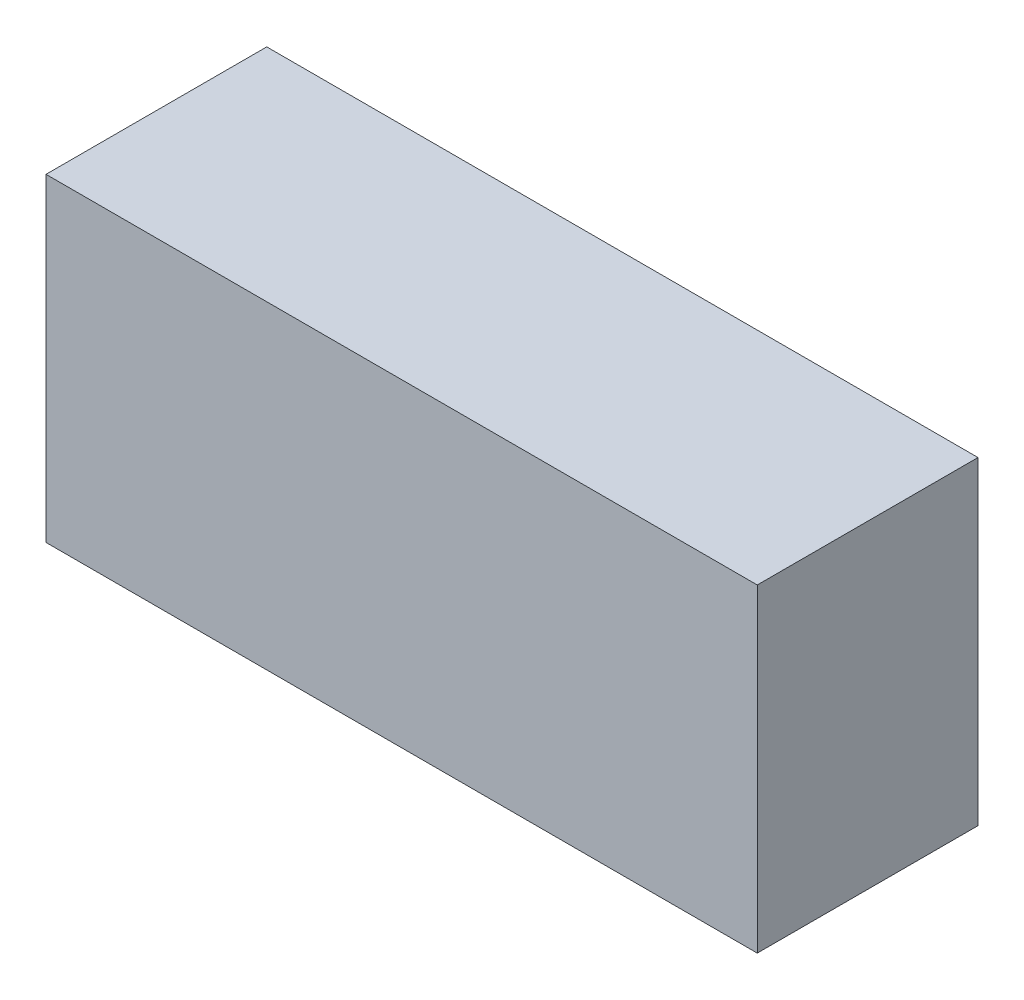
ISO-10303-21;
HEADER;
FILE_DESCRIPTION(('STEP AP214'),'2;1');
FILE_NAME('part.step','',(''),(''),'','','');
FILE_SCHEMA(('AUTOMOTIVE_DESIGN { 1 0 10303 214 1 1 1 1 }'));
ENDSEC;
DATA;
#1=APPLICATION_CONTEXT('core data for automotive mechanical design processes');
#2=APPLICATION_PROTOCOL_DEFINITION('international standard','automotive_design',2000,#1);
#3=PRODUCT_CONTEXT('',#1,'mechanical');
#4=PRODUCT('Part','Part','',(#3));
#5=PRODUCT_RELATED_PRODUCT_CATEGORY('part','',(#4));
#6=PRODUCT_DEFINITION_FORMATION('','',#4);
#7=PRODUCT_DEFINITION_CONTEXT('part definition',#1,'design');
#8=PRODUCT_DEFINITION('design','',#6,#7);
#9=PRODUCT_DEFINITION_SHAPE('','',#8);
#10=(LENGTH_UNIT() NAMED_UNIT(*) SI_UNIT(.MILLI.,.METRE.));
#11=(NAMED_UNIT(*) PLANE_ANGLE_UNIT() SI_UNIT($,.RADIAN.));
#12=(NAMED_UNIT(*) SI_UNIT($,.STERADIAN.) SOLID_ANGLE_UNIT());
#13=UNCERTAINTY_MEASURE_WITH_UNIT(LENGTH_MEASURE(1.E-05),#10,'distance_accuracy_value','');
#14=(GEOMETRIC_REPRESENTATION_CONTEXT(3) GLOBAL_UNCERTAINTY_ASSIGNED_CONTEXT((#13)) GLOBAL_UNIT_ASSIGNED_CONTEXT((#10,
#11,#12)) REPRESENTATION_CONTEXT('',''));
#15=CARTESIAN_POINT('',(0.,0.,0.));
#16=DIRECTION('',(0.,0.,1.));
#17=DIRECTION('',(1.,0.,0.));
#18=AXIS2_PLACEMENT_3D('',#15,#16,#17);
#19=CARTESIAN_POINT('',(0.,0.,0.45));
#20=DIRECTION('',(0.,0.,1.));
#21=DIRECTION('',(1.,0.,0.));
#22=AXIS2_PLACEMENT_3D('',#19,#20,#21);
#23=PLANE('',#22);
#24=DIRECTION('',(1.,0.,0.));
#25=VECTOR('',#24,1.);
#26=CARTESIAN_POINT('',(2.9,0.,0.45));
#27=LINE('',#26,#25);
#28=CARTESIAN_POINT('',(0.,0.,0.45));
#29=VERTEX_POINT('',#28);
#30=CARTESIAN_POINT('',(2.9,0.,0.45));
#31=VERTEX_POINT('',#30);
#32=EDGE_CURVE('E57',#29,#31,#27,.T.);
#33=ORIENTED_EDGE('',*,*,#32,.F.);
#34=DIRECTION('',(0.,1.,0.));
#35=VECTOR('',#34,1.);
#36=CARTESIAN_POINT('',(0.,0.,0.45));
#37=LINE('',#36,#35);
#38=CARTESIAN_POINT('',(0.,-1.3,0.45));
#39=VERTEX_POINT('',#38);
#40=EDGE_CURVE('E52',#39,#29,#37,.T.);
#41=ORIENTED_EDGE('',*,*,#40,.F.);
#42=DIRECTION('',(1.,0.,0.));
#43=VECTOR('',#42,1.);
#44=CARTESIAN_POINT('',(0.,-1.3,0.45));
#45=LINE('',#44,#43);
#46=CARTESIAN_POINT('',(2.9,-1.3,0.45));
#47=VERTEX_POINT('',#46);
#48=EDGE_CURVE('E67',#47,#39,#45,.F.);
#49=ORIENTED_EDGE('',*,*,#48,.F.);
#50=DIRECTION('',(0.,1.,0.));
#51=VECTOR('',#50,1.);
#52=CARTESIAN_POINT('',(2.9,-1.3,0.45));
#53=LINE('',#52,#51);
#54=EDGE_CURVE('E19',#31,#47,#53,.F.);
#55=ORIENTED_EDGE('',*,*,#54,.F.);
#56=EDGE_LOOP('',(#33,#41,#49,#55));
#57=FACE_BOUND('',#56,.T.);
#58=ADVANCED_FACE('F16',(#57),#23,.T.);
#59=CARTESIAN_POINT('',(2.9,-1.3,-0.45));
#60=DIRECTION('',(1.,0.,0.));
#61=DIRECTION('',(0.,0.,-1.));
#62=AXIS2_PLACEMENT_3D('',#59,#60,#61);
#63=PLANE('',#62);
#64=DIRECTION('',(0.,0.,-1.));
#65=VECTOR('',#64,1.);
#66=CARTESIAN_POINT('',(2.9,-1.3,-0.45));
#67=LINE('',#66,#65);
#68=CARTESIAN_POINT('',(2.9,-1.3,-0.45));
#69=VERTEX_POINT('',#68);
#70=EDGE_CURVE('E78',#69,#47,#67,.F.);
#71=ORIENTED_EDGE('',*,*,#70,.F.);
#72=DIRECTION('',(0.,1.,0.));
#73=VECTOR('',#72,1.);
#74=CARTESIAN_POINT('',(2.9,0.,-0.45));
#75=LINE('',#74,#73);
#76=CARTESIAN_POINT('',(2.9,0.,-0.45));
#77=VERTEX_POINT('',#76);
#78=EDGE_CURVE('E73',#69,#77,#75,.T.);
#79=ORIENTED_EDGE('',*,*,#78,.T.);
#80=DIRECTION('',(0.,0.,1.));
#81=VECTOR('',#80,1.);
#82=CARTESIAN_POINT('',(2.9,0.,-0.45));
#83=LINE('',#82,#81);
#84=EDGE_CURVE('E62',#31,#77,#83,.F.);
#85=ORIENTED_EDGE('',*,*,#84,.F.);
#86=ORIENTED_EDGE('',*,*,#54,.T.);
#87=EDGE_LOOP('',(#71,#79,#85,#86));
#88=FACE_BOUND('',#87,.T.);
#89=ADVANCED_FACE('F72',(#88),#63,.T.);
#90=CARTESIAN_POINT('',(2.9,0.,-0.45));
#91=DIRECTION('',(0.,1.,0.));
#92=DIRECTION('',(0.,0.,1.));
#93=AXIS2_PLACEMENT_3D('',#90,#91,#92);
#94=PLANE('',#93);
#95=ORIENTED_EDGE('',*,*,#84,.T.);
#96=DIRECTION('',(1.,0.,0.));
#97=VECTOR('',#96,1.);
#98=CARTESIAN_POINT('',(0.,0.,-0.45));
#99=LINE('',#98,#97);
#100=CARTESIAN_POINT('',(0.,0.,-0.45));
#101=VERTEX_POINT('',#100);
#102=EDGE_CURVE('E83',#77,#101,#99,.F.);
#103=ORIENTED_EDGE('',*,*,#102,.T.);
#104=DIRECTION('',(0.,0.,1.));
#105=VECTOR('',#104,1.);
#106=CARTESIAN_POINT('',(0.,0.,-0.45));
#107=LINE('',#106,#105);
#108=EDGE_CURVE('E64',#29,#101,#107,.F.);
#109=ORIENTED_EDGE('',*,*,#108,.F.);
#110=ORIENTED_EDGE('',*,*,#32,.T.);
#111=EDGE_LOOP('',(#95,#103,#109,#110));
#112=FACE_BOUND('',#111,.T.);
#113=ADVANCED_FACE('F59',(#112),#94,.T.);
#114=CARTESIAN_POINT('',(0.,0.,-0.45));
#115=DIRECTION('',(-1.,0.,0.));
#116=DIRECTION('',(0.,0.,1.));
#117=AXIS2_PLACEMENT_3D('',#114,#115,#116);
#118=PLANE('',#117);
#119=ORIENTED_EDGE('',*,*,#108,.T.);
#120=DIRECTION('',(0.,1.,0.));
#121=VECTOR('',#120,1.);
#122=CARTESIAN_POINT('',(0.,0.,-0.45));
#123=LINE('',#122,#121);
#124=CARTESIAN_POINT('',(0.,-1.3,-0.45));
#125=VERTEX_POINT('',#124);
#126=EDGE_CURVE('E25',#101,#125,#123,.F.);
#127=ORIENTED_EDGE('',*,*,#126,.T.);
#128=DIRECTION('',(0.,0.,-1.));
#129=VECTOR('',#128,1.);
#130=CARTESIAN_POINT('',(0.,-1.3,-0.45));
#131=LINE('',#130,#129);
#132=EDGE_CURVE('E33',#39,#125,#131,.T.);
#133=ORIENTED_EDGE('',*,*,#132,.F.);
#134=ORIENTED_EDGE('',*,*,#40,.T.);
#135=EDGE_LOOP('',(#119,#127,#133,#134));
#136=FACE_BOUND('',#135,.T.);
#137=ADVANCED_FACE('F87',(#136),#118,.T.);
#138=CARTESIAN_POINT('',(0.,-1.3,-0.45));
#139=DIRECTION('',(0.,-1.,0.));
#140=DIRECTION('',(0.,0.,-1.));
#141=AXIS2_PLACEMENT_3D('',#138,#139,#140);
#142=PLANE('',#141);
#143=ORIENTED_EDGE('',*,*,#132,.T.);
#144=DIRECTION('',(1.,0.,0.));
#145=VECTOR('',#144,1.);
#146=CARTESIAN_POINT('',(0.,-1.3,-0.45));
#147=LINE('',#146,#145);
#148=EDGE_CURVE('E11',#125,#69,#147,.T.);
#149=ORIENTED_EDGE('',*,*,#148,.T.);
#150=ORIENTED_EDGE('',*,*,#70,.T.);
#151=ORIENTED_EDGE('',*,*,#48,.T.);
#152=EDGE_LOOP('',(#143,#149,#150,#151));
#153=FACE_BOUND('',#152,.T.);
#154=ADVANCED_FACE('F90',(#153),#142,.T.);
#155=CARTESIAN_POINT('',(0.,0.,-0.45));
#156=DIRECTION('',(0.,0.,1.));
#157=DIRECTION('',(1.,0.,0.));
#158=AXIS2_PLACEMENT_3D('',#155,#156,#157);
#159=PLANE('',#158);
#160=ORIENTED_EDGE('',*,*,#126,.F.);
#161=ORIENTED_EDGE('',*,*,#102,.F.);
#162=ORIENTED_EDGE('',*,*,#78,.F.);
#163=ORIENTED_EDGE('',*,*,#148,.F.);
#164=EDGE_LOOP('',(#160,#161,#162,#163));
#165=FACE_BOUND('',#164,.T.);
#166=ADVANCED_FACE('F89',(#165),#159,.F.);
#167=CLOSED_SHELL('',(#58,#89,#113,#137,#154,#166));
#168=MANIFOLD_SOLID_BREP('B1',#167);
#169=ADVANCED_BREP_SHAPE_REPRESENTATION('',(#18,#168),#14);
#170=SHAPE_DEFINITION_REPRESENTATION(#9,#169);
ENDSEC;
END-ISO-10303-21;
